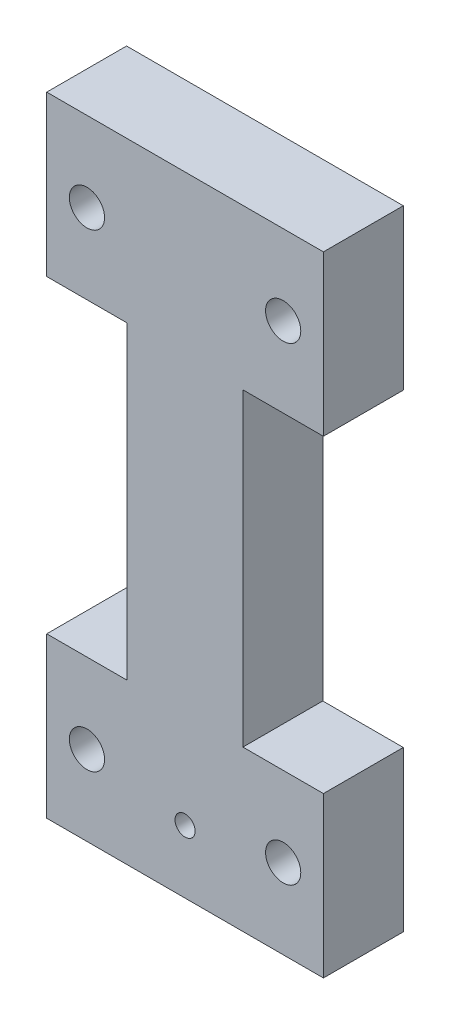
ISO-10303-21;
HEADER;
FILE_DESCRIPTION(('STEP AP214'),'2;1');
FILE_NAME('part.step','',(''),(''),'','','');
FILE_SCHEMA(('AUTOMOTIVE_DESIGN { 1 0 10303 214 1 1 1 1 }'));
ENDSEC;
DATA;
#1=APPLICATION_CONTEXT('core data for automotive mechanical design processes');
#2=APPLICATION_PROTOCOL_DEFINITION('international standard','automotive_design',2000,#1);
#3=PRODUCT_CONTEXT('',#1,'mechanical');
#4=PRODUCT('Part','Part','',(#3));
#5=PRODUCT_RELATED_PRODUCT_CATEGORY('part','',(#4));
#6=PRODUCT_DEFINITION_FORMATION('','',#4);
#7=PRODUCT_DEFINITION_CONTEXT('part definition',#1,'design');
#8=PRODUCT_DEFINITION('design','',#6,#7);
#9=PRODUCT_DEFINITION_SHAPE('','',#8);
#10=(LENGTH_UNIT() NAMED_UNIT(*) SI_UNIT(.MILLI.,.METRE.));
#11=(NAMED_UNIT(*) PLANE_ANGLE_UNIT() SI_UNIT($,.RADIAN.));
#12=(NAMED_UNIT(*) SI_UNIT($,.STERADIAN.) SOLID_ANGLE_UNIT());
#13=UNCERTAINTY_MEASURE_WITH_UNIT(LENGTH_MEASURE(1.E-05),#10,'distance_accuracy_value','');
#14=(GEOMETRIC_REPRESENTATION_CONTEXT(3) GLOBAL_UNCERTAINTY_ASSIGNED_CONTEXT((#13)) GLOBAL_UNIT_ASSIGNED_CONTEXT((#10,
#11,#12)) REPRESENTATION_CONTEXT('',''));
#15=CARTESIAN_POINT('',(0.,0.,0.));
#16=DIRECTION('',(0.,0.,1.));
#17=DIRECTION('',(1.,0.,0.));
#18=AXIS2_PLACEMENT_3D('',#15,#16,#17);
#19=CARTESIAN_POINT('',(0.,-25.,6.35));
#20=DIRECTION('',(0.,1.,0.));
#21=DIRECTION('',(-1.,0.,0.));
#22=AXIS2_PLACEMENT_3D('',#19,#20,#21);
#23=PLANE('',#22);
#24=DIRECTION('',(1.,0.,0.));
#25=VECTOR('',#24,1.);
#26=CARTESIAN_POINT('',(0.,-25.,0.));
#27=LINE('',#26,#25);
#28=CARTESIAN_POINT('',(-11.,-25.,0.));
#29=VERTEX_POINT('',#28);
#30=CARTESIAN_POINT('',(11.,-25.,0.));
#31=VERTEX_POINT('',#30);
#32=EDGE_CURVE('E173',#29,#31,#27,.T.);
#33=ORIENTED_EDGE('',*,*,#32,.T.);
#34=DIRECTION('',(0.,0.,-1.));
#35=VECTOR('',#34,1.);
#36=CARTESIAN_POINT('',(11.,-25.,6.35));
#37=LINE('',#36,#35);
#38=CARTESIAN_POINT('',(11.,-25.,6.35));
#39=VERTEX_POINT('',#38);
#40=EDGE_CURVE('E11',#39,#31,#37,.T.);
#41=ORIENTED_EDGE('',*,*,#40,.F.);
#42=DIRECTION('',(1.,0.,0.));
#43=VECTOR('',#42,1.);
#44=CARTESIAN_POINT('',(0.,-25.,6.35));
#45=LINE('',#44,#43);
#46=CARTESIAN_POINT('',(-11.,-25.,6.35));
#47=VERTEX_POINT('',#46);
#48=EDGE_CURVE('E346',#47,#39,#45,.T.);
#49=ORIENTED_EDGE('',*,*,#48,.F.);
#50=DIRECTION('',(0.,0.,-1.));
#51=VECTOR('',#50,1.);
#52=CARTESIAN_POINT('',(-11.,-25.,6.35));
#53=LINE('',#52,#51);
#54=EDGE_CURVE('E54',#47,#29,#53,.T.);
#55=ORIENTED_EDGE('',*,*,#54,.T.);
#56=EDGE_LOOP('',(#33,#41,#49,#55));
#57=FACE_BOUND('',#56,.T.);
#58=ADVANCED_FACE('F37',(#57),#23,.F.);
#59=CARTESIAN_POINT('',(11.,0.,6.35));
#60=DIRECTION('',(-1.,0.,0.));
#61=DIRECTION('',(0.,-1.,0.));
#62=AXIS2_PLACEMENT_3D('',#59,#60,#61);
#63=PLANE('',#62);
#64=DIRECTION('',(0.,1.,0.));
#65=VECTOR('',#64,1.);
#66=CARTESIAN_POINT('',(11.,0.,0.));
#67=LINE('',#66,#65);
#68=CARTESIAN_POINT('',(11.,-12.3,0.));
#69=VERTEX_POINT('',#68);
#70=EDGE_CURVE('E176',#31,#69,#67,.T.);
#71=ORIENTED_EDGE('',*,*,#70,.T.);
#72=DIRECTION('',(0.,0.,-1.));
#73=VECTOR('',#72,1.);
#74=CARTESIAN_POINT('',(11.,-12.3,6.35));
#75=LINE('',#74,#73);
#76=CARTESIAN_POINT('',(11.,-12.3,6.35));
#77=VERTEX_POINT('',#76);
#78=EDGE_CURVE('E46',#77,#69,#75,.T.);
#79=ORIENTED_EDGE('',*,*,#78,.F.);
#80=DIRECTION('',(0.,1.,0.));
#81=VECTOR('',#80,1.);
#82=CARTESIAN_POINT('',(11.,0.,6.35));
#83=LINE('',#82,#81);
#84=EDGE_CURVE('E105',#39,#77,#83,.T.);
#85=ORIENTED_EDGE('',*,*,#84,.F.);
#86=ORIENTED_EDGE('',*,*,#40,.T.);
#87=EDGE_LOOP('',(#71,#79,#85,#86));
#88=FACE_BOUND('',#87,.T.);
#89=ADVANCED_FACE('F236',(#88),#63,.F.);
#90=CARTESIAN_POINT('',(0.,-12.3,6.35));
#91=DIRECTION('',(0.,1.,0.));
#92=DIRECTION('',(0.,0.,1.));
#93=AXIS2_PLACEMENT_3D('',#90,#91,#92);
#94=PLANE('',#93);
#95=DIRECTION('',(1.,0.,0.));
#96=VECTOR('',#95,1.);
#97=CARTESIAN_POINT('',(0.,-12.3,0.));
#98=LINE('',#97,#96);
#99=CARTESIAN_POINT('',(4.6,-12.3,0.));
#100=VERTEX_POINT('',#99);
#101=EDGE_CURVE('E179',#100,#69,#98,.T.);
#102=ORIENTED_EDGE('',*,*,#101,.F.);
#103=DIRECTION('',(0.,0.,-1.));
#104=VECTOR('',#103,1.);
#105=CARTESIAN_POINT('',(4.6,-12.3,6.35));
#106=LINE('',#105,#104);
#107=CARTESIAN_POINT('',(4.6,-12.3,6.35));
#108=VERTEX_POINT('',#107);
#109=EDGE_CURVE('E229',#108,#100,#106,.T.);
#110=ORIENTED_EDGE('',*,*,#109,.F.);
#111=DIRECTION('',(1.,0.,0.));
#112=VECTOR('',#111,1.);
#113=CARTESIAN_POINT('',(0.,-12.3,6.35));
#114=LINE('',#113,#112);
#115=EDGE_CURVE('E235',#108,#77,#114,.T.);
#116=ORIENTED_EDGE('',*,*,#115,.T.);
#117=ORIENTED_EDGE('',*,*,#78,.T.);
#118=EDGE_LOOP('',(#102,#110,#116,#117));
#119=FACE_BOUND('',#118,.T.);
#120=ADVANCED_FACE('F233',(#119),#94,.T.);
#121=CARTESIAN_POINT('',(4.6,0.,6.35));
#122=DIRECTION('',(-1.,0.,0.));
#123=DIRECTION('',(0.,-1.,0.));
#124=AXIS2_PLACEMENT_3D('',#121,#122,#123);
#125=PLANE('',#124);
#126=DIRECTION('',(0.,1.,0.));
#127=VECTOR('',#126,1.);
#128=CARTESIAN_POINT('',(4.6,0.,0.));
#129=LINE('',#128,#127);
#130=CARTESIAN_POINT('',(4.6,12.3,0.));
#131=VERTEX_POINT('',#130);
#132=EDGE_CURVE('E182',#100,#131,#129,.T.);
#133=ORIENTED_EDGE('',*,*,#132,.T.);
#134=DIRECTION('',(0.,0.,-1.));
#135=VECTOR('',#134,1.);
#136=CARTESIAN_POINT('',(4.6,12.3,6.35));
#137=LINE('',#136,#135);
#138=CARTESIAN_POINT('',(4.6,12.3,6.35));
#139=VERTEX_POINT('',#138);
#140=EDGE_CURVE('E226',#139,#131,#137,.T.);
#141=ORIENTED_EDGE('',*,*,#140,.F.);
#142=DIRECTION('',(0.,1.,0.));
#143=VECTOR('',#142,1.);
#144=CARTESIAN_POINT('',(4.6,0.,6.35));
#145=LINE('',#144,#143);
#146=EDGE_CURVE('E255',#108,#139,#145,.T.);
#147=ORIENTED_EDGE('',*,*,#146,.F.);
#148=ORIENTED_EDGE('',*,*,#109,.T.);
#149=EDGE_LOOP('',(#133,#141,#147,#148));
#150=FACE_BOUND('',#149,.T.);
#151=ADVANCED_FACE('F245',(#150),#125,.F.);
#152=CARTESIAN_POINT('',(0.,12.3,6.35));
#153=DIRECTION('',(0.,1.,0.));
#154=DIRECTION('',(0.,0.,1.));
#155=AXIS2_PLACEMENT_3D('',#152,#153,#154);
#156=PLANE('',#155);
#157=DIRECTION('',(1.,0.,0.));
#158=VECTOR('',#157,1.);
#159=CARTESIAN_POINT('',(0.,12.3,0.));
#160=LINE('',#159,#158);
#161=CARTESIAN_POINT('',(11.,12.3,0.));
#162=VERTEX_POINT('',#161);
#163=EDGE_CURVE('E184',#131,#162,#160,.T.);
#164=ORIENTED_EDGE('',*,*,#163,.T.);
#165=DIRECTION('',(0.,0.,-1.));
#166=VECTOR('',#165,1.);
#167=CARTESIAN_POINT('',(11.,12.3,6.35));
#168=LINE('',#167,#166);
#169=CARTESIAN_POINT('',(11.,12.3,6.35));
#170=VERTEX_POINT('',#169);
#171=EDGE_CURVE('E224',#170,#162,#168,.T.);
#172=ORIENTED_EDGE('',*,*,#171,.F.);
#173=DIRECTION('',(1.,0.,0.));
#174=VECTOR('',#173,1.);
#175=CARTESIAN_POINT('',(0.,12.3,6.35));
#176=LINE('',#175,#174);
#177=EDGE_CURVE('E251',#139,#170,#176,.T.);
#178=ORIENTED_EDGE('',*,*,#177,.F.);
#179=ORIENTED_EDGE('',*,*,#140,.T.);
#180=EDGE_LOOP('',(#164,#172,#178,#179));
#181=FACE_BOUND('',#180,.T.);
#182=ADVANCED_FACE('F249',(#181),#156,.F.);
#183=CARTESIAN_POINT('',(11.,0.,6.35));
#184=DIRECTION('',(1.,0.,0.));
#185=DIRECTION('',(0.,1.,0.));
#186=AXIS2_PLACEMENT_3D('',#183,#184,#185);
#187=PLANE('',#186);
#188=DIRECTION('',(0.,-1.,0.));
#189=VECTOR('',#188,1.);
#190=CARTESIAN_POINT('',(11.,0.,0.));
#191=LINE('',#190,#189);
#192=CARTESIAN_POINT('',(11.,25.,0.));
#193=VERTEX_POINT('',#192);
#194=EDGE_CURVE('E187',#193,#162,#191,.T.);
#195=ORIENTED_EDGE('',*,*,#194,.F.);
#196=DIRECTION('',(0.,0.,-1.));
#197=VECTOR('',#196,1.);
#198=CARTESIAN_POINT('',(11.,25.,6.35));
#199=LINE('',#198,#197);
#200=CARTESIAN_POINT('',(11.,25.,6.35));
#201=VERTEX_POINT('',#200);
#202=EDGE_CURVE('E222',#201,#193,#199,.T.);
#203=ORIENTED_EDGE('',*,*,#202,.F.);
#204=DIRECTION('',(0.,-1.,0.));
#205=VECTOR('',#204,1.);
#206=CARTESIAN_POINT('',(11.,0.,6.35));
#207=LINE('',#206,#205);
#208=EDGE_CURVE('E254',#201,#170,#207,.T.);
#209=ORIENTED_EDGE('',*,*,#208,.T.);
#210=ORIENTED_EDGE('',*,*,#171,.T.);
#211=EDGE_LOOP('',(#195,#203,#209,#210));
#212=FACE_BOUND('',#211,.T.);
#213=ADVANCED_FACE('F298',(#212),#187,.T.);
#214=CARTESIAN_POINT('',(0.,25.,6.35));
#215=DIRECTION('',(0.,-1.,0.));
#216=DIRECTION('',(0.,0.,-1.));
#217=AXIS2_PLACEMENT_3D('',#214,#215,#216);
#218=PLANE('',#217);
#219=DIRECTION('',(-1.,0.,0.));
#220=VECTOR('',#219,1.);
#221=CARTESIAN_POINT('',(0.,25.,0.));
#222=LINE('',#221,#220);
#223=CARTESIAN_POINT('',(-11.,25.,0.));
#224=VERTEX_POINT('',#223);
#225=EDGE_CURVE('E190',#193,#224,#222,.T.);
#226=ORIENTED_EDGE('',*,*,#225,.T.);
#227=DIRECTION('',(0.,0.,-1.));
#228=VECTOR('',#227,1.);
#229=CARTESIAN_POINT('',(-11.,25.,6.35));
#230=LINE('',#229,#228);
#231=CARTESIAN_POINT('',(-11.,25.,6.35));
#232=VERTEX_POINT('',#231);
#233=EDGE_CURVE('E219',#232,#224,#230,.T.);
#234=ORIENTED_EDGE('',*,*,#233,.F.);
#235=DIRECTION('',(-1.,0.,0.));
#236=VECTOR('',#235,1.);
#237=CARTESIAN_POINT('',(0.,25.,6.35));
#238=LINE('',#237,#236);
#239=EDGE_CURVE('E257',#201,#232,#238,.T.);
#240=ORIENTED_EDGE('',*,*,#239,.F.);
#241=ORIENTED_EDGE('',*,*,#202,.T.);
#242=EDGE_LOOP('',(#226,#234,#240,#241));
#243=FACE_BOUND('',#242,.T.);
#244=ADVANCED_FACE('F301',(#243),#218,.F.);
#245=CARTESIAN_POINT('',(-11.,0.,6.35));
#246=DIRECTION('',(1.,0.,0.));
#247=DIRECTION('',(0.,1.,0.));
#248=AXIS2_PLACEMENT_3D('',#245,#246,#247);
#249=PLANE('',#248);
#250=DIRECTION('',(0.,-1.,0.));
#251=VECTOR('',#250,1.);
#252=CARTESIAN_POINT('',(-11.,0.,0.));
#253=LINE('',#252,#251);
#254=CARTESIAN_POINT('',(-11.,12.3,0.));
#255=VERTEX_POINT('',#254);
#256=EDGE_CURVE('E192',#224,#255,#253,.T.);
#257=ORIENTED_EDGE('',*,*,#256,.T.);
#258=DIRECTION('',(0.,0.,-1.));
#259=VECTOR('',#258,1.);
#260=CARTESIAN_POINT('',(-11.,12.3,6.35));
#261=LINE('',#260,#259);
#262=CARTESIAN_POINT('',(-11.,12.3,6.35));
#263=VERTEX_POINT('',#262);
#264=EDGE_CURVE('E217',#263,#255,#261,.T.);
#265=ORIENTED_EDGE('',*,*,#264,.F.);
#266=DIRECTION('',(0.,-1.,0.));
#267=VECTOR('',#266,1.);
#268=CARTESIAN_POINT('',(-11.,0.,6.35));
#269=LINE('',#268,#267);
#270=EDGE_CURVE('E156',#232,#263,#269,.T.);
#271=ORIENTED_EDGE('',*,*,#270,.F.);
#272=ORIENTED_EDGE('',*,*,#233,.T.);
#273=EDGE_LOOP('',(#257,#265,#271,#272));
#274=FACE_BOUND('',#273,.T.);
#275=ADVANCED_FACE('F267',(#274),#249,.F.);
#276=CARTESIAN_POINT('',(0.,12.3,6.35));
#277=DIRECTION('',(0.,-1.,0.));
#278=DIRECTION('',(1.,0.,0.));
#279=AXIS2_PLACEMENT_3D('',#276,#277,#278);
#280=PLANE('',#279);
#281=DIRECTION('',(-1.,0.,0.));
#282=VECTOR('',#281,1.);
#283=CARTESIAN_POINT('',(0.,12.3,0.));
#284=LINE('',#283,#282);
#285=CARTESIAN_POINT('',(-4.6,12.3,0.));
#286=VERTEX_POINT('',#285);
#287=EDGE_CURVE('E195',#286,#255,#284,.T.);
#288=ORIENTED_EDGE('',*,*,#287,.F.);
#289=DIRECTION('',(0.,0.,-1.));
#290=VECTOR('',#289,1.);
#291=CARTESIAN_POINT('',(-4.6,12.3,6.35));
#292=LINE('',#291,#290);
#293=CARTESIAN_POINT('',(-4.6,12.3,6.35));
#294=VERTEX_POINT('',#293);
#295=EDGE_CURVE('E142',#294,#286,#292,.T.);
#296=ORIENTED_EDGE('',*,*,#295,.F.);
#297=DIRECTION('',(-1.,0.,0.));
#298=VECTOR('',#297,1.);
#299=CARTESIAN_POINT('',(0.,12.3,6.35));
#300=LINE('',#299,#298);
#301=EDGE_CURVE('E154',#294,#263,#300,.T.);
#302=ORIENTED_EDGE('',*,*,#301,.T.);
#303=ORIENTED_EDGE('',*,*,#264,.T.);
#304=EDGE_LOOP('',(#288,#296,#302,#303));
#305=FACE_BOUND('',#304,.T.);
#306=ADVANCED_FACE('F271',(#305),#280,.T.);
#307=CARTESIAN_POINT('',(-4.6,0.,6.35));
#308=DIRECTION('',(-1.,0.,0.));
#309=DIRECTION('',(0.,-1.,0.));
#310=AXIS2_PLACEMENT_3D('',#307,#308,#309);
#311=PLANE('',#310);
#312=DIRECTION('',(0.,1.,0.));
#313=VECTOR('',#312,1.);
#314=CARTESIAN_POINT('',(-4.6,0.,0.));
#315=LINE('',#314,#313);
#316=CARTESIAN_POINT('',(-4.6,-12.3,0.));
#317=VERTEX_POINT('',#316);
#318=EDGE_CURVE('E139',#317,#286,#315,.T.);
#319=ORIENTED_EDGE('',*,*,#318,.F.);
#320=DIRECTION('',(0.,0.,-1.));
#321=VECTOR('',#320,1.);
#322=CARTESIAN_POINT('',(-4.6,-12.3,6.35));
#323=LINE('',#322,#321);
#324=CARTESIAN_POINT('',(-4.6,-12.3,6.35));
#325=VERTEX_POINT('',#324);
#326=EDGE_CURVE('E133',#325,#317,#323,.T.);
#327=ORIENTED_EDGE('',*,*,#326,.F.);
#328=DIRECTION('',(0.,1.,0.));
#329=VECTOR('',#328,1.);
#330=CARTESIAN_POINT('',(-4.6,0.,6.35));
#331=LINE('',#330,#329);
#332=EDGE_CURVE('E137',#325,#294,#331,.T.);
#333=ORIENTED_EDGE('',*,*,#332,.T.);
#334=ORIENTED_EDGE('',*,*,#295,.T.);
#335=EDGE_LOOP('',(#319,#327,#333,#334));
#336=FACE_BOUND('',#335,.T.);
#337=ADVANCED_FACE('F135',(#336),#311,.T.);
#338=CARTESIAN_POINT('',(0.,-12.3,6.35));
#339=DIRECTION('',(0.,-1.,0.));
#340=DIRECTION('',(0.,0.,-1.));
#341=AXIS2_PLACEMENT_3D('',#338,#339,#340);
#342=PLANE('',#341);
#343=DIRECTION('',(-1.,0.,0.));
#344=VECTOR('',#343,1.);
#345=CARTESIAN_POINT('',(0.,-12.3,0.));
#346=LINE('',#345,#344);
#347=CARTESIAN_POINT('',(-11.,-12.3,0.));
#348=VERTEX_POINT('',#347);
#349=EDGE_CURVE('E199',#317,#348,#346,.T.);
#350=ORIENTED_EDGE('',*,*,#349,.T.);
#351=DIRECTION('',(0.,0.,-1.));
#352=VECTOR('',#351,1.);
#353=CARTESIAN_POINT('',(-11.,-12.3,6.35));
#354=LINE('',#353,#352);
#355=CARTESIAN_POINT('',(-11.,-12.3,6.35));
#356=VERTEX_POINT('',#355);
#357=EDGE_CURVE('E93',#356,#348,#354,.T.);
#358=ORIENTED_EDGE('',*,*,#357,.F.);
#359=DIRECTION('',(-1.,0.,0.));
#360=VECTOR('',#359,1.);
#361=CARTESIAN_POINT('',(0.,-12.3,6.35));
#362=LINE('',#361,#360);
#363=EDGE_CURVE('E144',#325,#356,#362,.T.);
#364=ORIENTED_EDGE('',*,*,#363,.F.);
#365=ORIENTED_EDGE('',*,*,#326,.T.);
#366=EDGE_LOOP('',(#350,#358,#364,#365));
#367=FACE_BOUND('',#366,.T.);
#368=ADVANCED_FACE('F145',(#367),#342,.F.);
#369=CARTESIAN_POINT('',(-7.8,18.65,6.35));
#370=DIRECTION('',(0.,0.,-1.));
#371=DIRECTION('',(-1.,0.,0.));
#372=AXIS2_PLACEMENT_3D('',#369,#370,#371);
#373=CYLINDRICAL_SURFACE('',#372,1.4);
#374=CARTESIAN_POINT('',(-7.8,18.65,6.35));
#375=DIRECTION('',(0.,0.,1.));
#376=DIRECTION('',(1.,0.,0.));
#377=AXIS2_PLACEMENT_3D('',#374,#375,#376);
#378=CIRCLE('',#377,1.4);
#379=CARTESIAN_POINT('',(-6.4,18.65,6.35));
#380=VERTEX_POINT('',#379);
#381=EDGE_CURVE('E164',#380,#380,#378,.T.);
#382=ORIENTED_EDGE('',*,*,#381,.T.);
#383=EDGE_LOOP('',(#382));
#384=FACE_BOUND('',#383,.T.);
#385=CARTESIAN_POINT('',(-7.8,18.65,0.));
#386=DIRECTION('',(0.,0.,1.));
#387=DIRECTION('',(1.,0.,0.));
#388=AXIS2_PLACEMENT_3D('',#385,#386,#387);
#389=CIRCLE('',#388,1.4);
#390=CARTESIAN_POINT('',(-6.4,18.65,0.));
#391=VERTEX_POINT('',#390);
#392=EDGE_CURVE('E207',#391,#391,#389,.T.);
#393=ORIENTED_EDGE('',*,*,#392,.F.);
#394=EDGE_LOOP('',(#393));
#395=FACE_BOUND('',#394,.T.);
#396=ADVANCED_FACE('F282',(#384,#395),#373,.F.);
#397=CARTESIAN_POINT('',(7.8,18.65,6.35));
#398=DIRECTION('',(0.,0.,-1.));
#399=DIRECTION('',(-1.,0.,0.));
#400=AXIS2_PLACEMENT_3D('',#397,#398,#399);
#401=CYLINDRICAL_SURFACE('',#400,1.4);
#402=CARTESIAN_POINT('',(7.8,18.65,6.35));
#403=DIRECTION('',(0.,0.,1.));
#404=DIRECTION('',(1.,0.,0.));
#405=AXIS2_PLACEMENT_3D('',#402,#403,#404);
#406=CIRCLE('',#405,1.4);
#407=CARTESIAN_POINT('',(9.2,18.65,6.35));
#408=VERTEX_POINT('',#407);
#409=EDGE_CURVE('E161',#408,#408,#406,.T.);
#410=ORIENTED_EDGE('',*,*,#409,.T.);
#411=EDGE_LOOP('',(#410));
#412=FACE_BOUND('',#411,.T.);
#413=CARTESIAN_POINT('',(7.8,18.65,0.));
#414=DIRECTION('',(0.,0.,1.));
#415=DIRECTION('',(1.,0.,0.));
#416=AXIS2_PLACEMENT_3D('',#413,#414,#415);
#417=CIRCLE('',#416,1.4);
#418=CARTESIAN_POINT('',(9.2,18.65,0.));
#419=VERTEX_POINT('',#418);
#420=EDGE_CURVE('E204',#419,#419,#417,.T.);
#421=ORIENTED_EDGE('',*,*,#420,.F.);
#422=EDGE_LOOP('',(#421));
#423=FACE_BOUND('',#422,.T.);
#424=ADVANCED_FACE('F274',(#412,#423),#401,.F.);
#425=CARTESIAN_POINT('',(-11.,0.,6.35));
#426=DIRECTION('',(-1.,0.,0.));
#427=DIRECTION('',(0.,0.,1.));
#428=AXIS2_PLACEMENT_3D('',#425,#426,#427);
#429=PLANE('',#428);
#430=DIRECTION('',(0.,1.,0.));
#431=VECTOR('',#430,1.);
#432=CARTESIAN_POINT('',(-11.,0.,0.));
#433=LINE('',#432,#431);
#434=EDGE_CURVE('E201',#29,#348,#433,.T.);
#435=ORIENTED_EDGE('',*,*,#434,.F.);
#436=ORIENTED_EDGE('',*,*,#54,.F.);
#437=DIRECTION('',(0.,1.,0.));
#438=VECTOR('',#437,1.);
#439=CARTESIAN_POINT('',(-11.,0.,6.35));
#440=LINE('',#439,#438);
#441=EDGE_CURVE('E148',#47,#356,#440,.T.);
#442=ORIENTED_EDGE('',*,*,#441,.T.);
#443=ORIENTED_EDGE('',*,*,#357,.T.);
#444=EDGE_LOOP('',(#435,#436,#442,#443));
#445=FACE_BOUND('',#444,.T.);
#446=ADVANCED_FACE('F272',(#445),#429,.T.);
#447=CARTESIAN_POINT('',(7.8,-18.65,6.35));
#448=DIRECTION('',(0.,0.,-1.));
#449=DIRECTION('',(-1.,0.,0.));
#450=AXIS2_PLACEMENT_3D('',#447,#448,#449);
#451=CYLINDRICAL_SURFACE('',#450,1.4);
#452=CARTESIAN_POINT('',(7.8,-18.65,6.35));
#453=DIRECTION('',(0.,0.,1.));
#454=DIRECTION('',(1.,0.,0.));
#455=AXIS2_PLACEMENT_3D('',#452,#453,#454);
#456=CIRCLE('',#455,1.4);
#457=CARTESIAN_POINT('',(9.2,-18.65,6.35));
#458=VERTEX_POINT('',#457);
#459=EDGE_CURVE('E213',#458,#458,#456,.T.);
#460=ORIENTED_EDGE('',*,*,#459,.T.);
#461=EDGE_LOOP('',(#460));
#462=FACE_BOUND('',#461,.T.);
#463=CARTESIAN_POINT('',(7.8,-18.65,0.));
#464=DIRECTION('',(0.,0.,1.));
#465=DIRECTION('',(1.,0.,0.));
#466=AXIS2_PLACEMENT_3D('',#463,#464,#465);
#467=CIRCLE('',#466,1.4);
#468=CARTESIAN_POINT('',(9.2,-18.65,0.));
#469=VERTEX_POINT('',#468);
#470=EDGE_CURVE('E170',#469,#469,#467,.T.);
#471=ORIENTED_EDGE('',*,*,#470,.F.);
#472=EDGE_LOOP('',(#471));
#473=FACE_BOUND('',#472,.T.);
#474=ADVANCED_FACE('F39',(#462,#473),#451,.F.);
#475=CARTESIAN_POINT('',(-7.8,-18.65,6.35));
#476=DIRECTION('',(0.,0.,-1.));
#477=DIRECTION('',(-1.,0.,0.));
#478=AXIS2_PLACEMENT_3D('',#475,#476,#477);
#479=CYLINDRICAL_SURFACE('',#478,1.4);
#480=CARTESIAN_POINT('',(-7.8,-18.65,6.35));
#481=DIRECTION('',(0.,0.,1.));
#482=DIRECTION('',(1.,0.,0.));
#483=AXIS2_PLACEMENT_3D('',#480,#481,#482);
#484=CIRCLE('',#483,1.4);
#485=CARTESIAN_POINT('',(-6.4,-18.65,6.35));
#486=VERTEX_POINT('',#485);
#487=EDGE_CURVE('E167',#486,#486,#484,.T.);
#488=ORIENTED_EDGE('',*,*,#487,.T.);
#489=EDGE_LOOP('',(#488));
#490=FACE_BOUND('',#489,.T.);
#491=CARTESIAN_POINT('',(-7.8,-18.65,0.));
#492=DIRECTION('',(0.,0.,1.));
#493=DIRECTION('',(1.,0.,0.));
#494=AXIS2_PLACEMENT_3D('',#491,#492,#493);
#495=CIRCLE('',#494,1.4);
#496=CARTESIAN_POINT('',(-6.4,-18.65,0.));
#497=VERTEX_POINT('',#496);
#498=EDGE_CURVE('E210',#497,#497,#495,.T.);
#499=ORIENTED_EDGE('',*,*,#498,.F.);
#500=EDGE_LOOP('',(#499));
#501=FACE_BOUND('',#500,.T.);
#502=ADVANCED_FACE('F280',(#490,#501),#479,.F.);
#503=CARTESIAN_POINT('',(0.,0.,6.35));
#504=DIRECTION('',(0.,0.,1.));
#505=DIRECTION('',(1.,0.,0.));
#506=AXIS2_PLACEMENT_3D('',#503,#504,#505);
#507=PLANE('',#506);
#508=CARTESIAN_POINT('',(0.,-20.,6.35));
#509=DIRECTION('',(0.,0.,1.));
#510=DIRECTION('',(1.,0.,0.));
#511=AXIS2_PLACEMENT_3D('',#508,#509,#510);
#512=CIRCLE('',#511,0.8);
#513=CARTESIAN_POINT('',(0.8,-20.,6.35));
#514=VERTEX_POINT('',#513);
#515=EDGE_CURVE('E340',#514,#514,#512,.T.);
#516=ORIENTED_EDGE('',*,*,#515,.F.);
#517=EDGE_LOOP('',(#516));
#518=FACE_BOUND('',#517,.T.);
#519=ORIENTED_EDGE('',*,*,#459,.F.);
#520=EDGE_LOOP('',(#519));
#521=FACE_BOUND('',#520,.T.);
#522=ORIENTED_EDGE('',*,*,#48,.T.);
#523=ORIENTED_EDGE('',*,*,#84,.T.);
#524=ORIENTED_EDGE('',*,*,#115,.F.);
#525=ORIENTED_EDGE('',*,*,#146,.T.);
#526=ORIENTED_EDGE('',*,*,#177,.T.);
#527=ORIENTED_EDGE('',*,*,#208,.F.);
#528=ORIENTED_EDGE('',*,*,#239,.T.);
#529=ORIENTED_EDGE('',*,*,#270,.T.);
#530=ORIENTED_EDGE('',*,*,#301,.F.);
#531=ORIENTED_EDGE('',*,*,#332,.F.);
#532=ORIENTED_EDGE('',*,*,#363,.T.);
#533=ORIENTED_EDGE('',*,*,#441,.F.);
#534=EDGE_LOOP('',(#522,#523,#524,#525,#526,#527,#528,#529,#530,#531,#532,#533));
#535=FACE_BOUND('',#534,.T.);
#536=ORIENTED_EDGE('',*,*,#409,.F.);
#537=EDGE_LOOP('',(#536));
#538=FACE_BOUND('',#537,.T.);
#539=ORIENTED_EDGE('',*,*,#381,.F.);
#540=EDGE_LOOP('',(#539));
#541=FACE_BOUND('',#540,.T.);
#542=ORIENTED_EDGE('',*,*,#487,.F.);
#543=EDGE_LOOP('',(#542));
#544=FACE_BOUND('',#543,.T.);
#545=ADVANCED_FACE('F151',(#518,#521,#535,#538,#541,#544),#507,.T.);
#546=CARTESIAN_POINT('',(0.,0.,0.));
#547=DIRECTION('',(0.,0.,1.));
#548=DIRECTION('',(1.,0.,0.));
#549=AXIS2_PLACEMENT_3D('',#546,#547,#548);
#550=PLANE('',#549);
#551=CARTESIAN_POINT('',(0.,-20.,0.));
#552=DIRECTION('',(0.,0.,1.));
#553=DIRECTION('',(1.,0.,0.));
#554=AXIS2_PLACEMENT_3D('',#551,#552,#553);
#555=CIRCLE('',#554,0.8);
#556=CARTESIAN_POINT('',(0.8,-20.,0.));
#557=VERTEX_POINT('',#556);
#558=EDGE_CURVE('E174',#557,#557,#555,.T.);
#559=ORIENTED_EDGE('',*,*,#558,.T.);
#560=EDGE_LOOP('',(#559));
#561=FACE_BOUND('',#560,.T.);
#562=ORIENTED_EDGE('',*,*,#470,.T.);
#563=EDGE_LOOP('',(#562));
#564=FACE_BOUND('',#563,.T.);
#565=ORIENTED_EDGE('',*,*,#32,.F.);
#566=ORIENTED_EDGE('',*,*,#434,.T.);
#567=ORIENTED_EDGE('',*,*,#349,.F.);
#568=ORIENTED_EDGE('',*,*,#318,.T.);
#569=ORIENTED_EDGE('',*,*,#287,.T.);
#570=ORIENTED_EDGE('',*,*,#256,.F.);
#571=ORIENTED_EDGE('',*,*,#225,.F.);
#572=ORIENTED_EDGE('',*,*,#194,.T.);
#573=ORIENTED_EDGE('',*,*,#163,.F.);
#574=ORIENTED_EDGE('',*,*,#132,.F.);
#575=ORIENTED_EDGE('',*,*,#101,.T.);
#576=ORIENTED_EDGE('',*,*,#70,.F.);
#577=EDGE_LOOP('',(#565,#566,#567,#568,#569,#570,#571,#572,#573,#574,#575,#576));
#578=FACE_BOUND('',#577,.T.);
#579=ORIENTED_EDGE('',*,*,#420,.T.);
#580=EDGE_LOOP('',(#579));
#581=FACE_BOUND('',#580,.T.);
#582=ORIENTED_EDGE('',*,*,#392,.T.);
#583=EDGE_LOOP('',(#582));
#584=FACE_BOUND('',#583,.T.);
#585=ORIENTED_EDGE('',*,*,#498,.T.);
#586=EDGE_LOOP('',(#585));
#587=FACE_BOUND('',#586,.T.);
#588=ADVANCED_FACE('F240',(#561,#564,#578,#581,#584,#587),#550,.F.);
#589=CARTESIAN_POINT('',(0.,-20.,0.));
#590=DIRECTION('',(0.,0.,1.));
#591=DIRECTION('',(1.,0.,0.));
#592=AXIS2_PLACEMENT_3D('',#589,#590,#591);
#593=CYLINDRICAL_SURFACE('',#592,0.8);
#594=ORIENTED_EDGE('',*,*,#558,.F.);
#595=EDGE_LOOP('',(#594));
#596=FACE_BOUND('',#595,.T.);
#597=ORIENTED_EDGE('',*,*,#515,.T.);
#598=EDGE_LOOP('',(#597));
#599=FACE_BOUND('',#598,.T.);
#600=ADVANCED_FACE('F326',(#596,#599),#593,.F.);
#601=CLOSED_SHELL('',(#58,#89,#120,#151,#182,#213,#244,#275,#306,#337,#368,#396,#424,#446,#474,
#502,#545,#588,#600));
#602=MANIFOLD_SOLID_BREP('B2',#601);
#603=ADVANCED_BREP_SHAPE_REPRESENTATION('',(#18,#602),#14);
#604=SHAPE_DEFINITION_REPRESENTATION(#9,#603);
ENDSEC;
END-ISO-10303-21;
